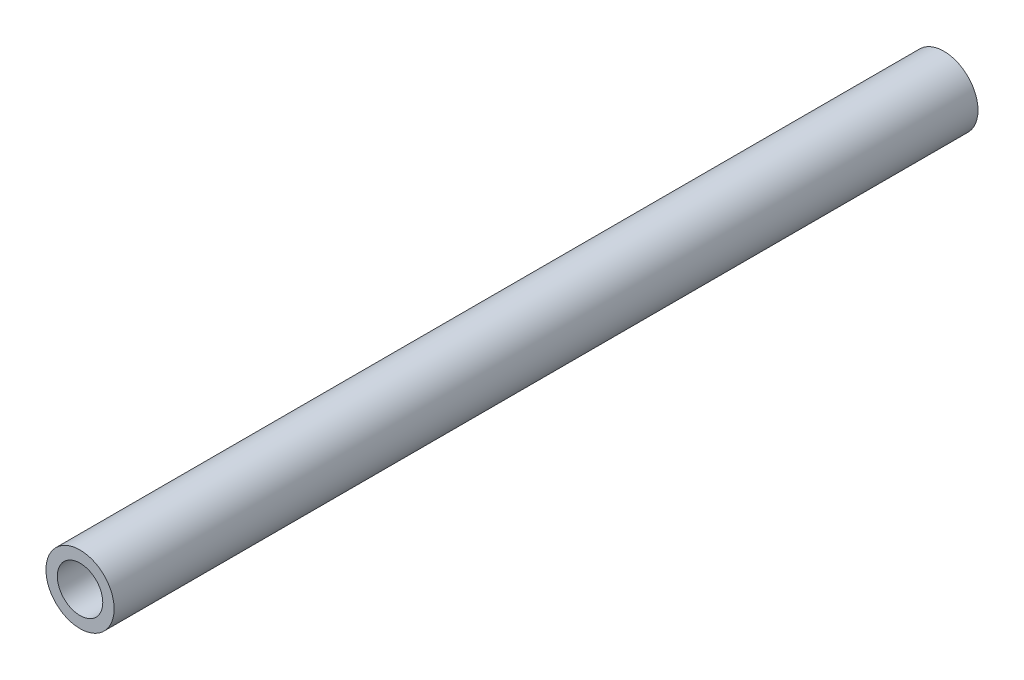
ISO-10303-21;
HEADER;
FILE_DESCRIPTION(('STEP AP214'),'2;1');
FILE_NAME('part.step','',(''),(''),'','','');
FILE_SCHEMA(('AUTOMOTIVE_DESIGN { 1 0 10303 214 1 1 1 1 }'));
ENDSEC;
DATA;
#1=APPLICATION_CONTEXT('core data for automotive mechanical design processes');
#2=APPLICATION_PROTOCOL_DEFINITION('international standard','automotive_design',2000,#1);
#3=PRODUCT_CONTEXT('',#1,'mechanical');
#4=PRODUCT('Part','Part','',(#3));
#5=PRODUCT_RELATED_PRODUCT_CATEGORY('part','',(#4));
#6=PRODUCT_DEFINITION_FORMATION('','',#4);
#7=PRODUCT_DEFINITION_CONTEXT('part definition',#1,'design');
#8=PRODUCT_DEFINITION('design','',#6,#7);
#9=PRODUCT_DEFINITION_SHAPE('','',#8);
#10=(LENGTH_UNIT() NAMED_UNIT(*) SI_UNIT(.MILLI.,.METRE.));
#11=(NAMED_UNIT(*) PLANE_ANGLE_UNIT() SI_UNIT($,.RADIAN.));
#12=(NAMED_UNIT(*) SI_UNIT($,.STERADIAN.) SOLID_ANGLE_UNIT());
#13=UNCERTAINTY_MEASURE_WITH_UNIT(LENGTH_MEASURE(1.E-05),#10,'distance_accuracy_value','');
#14=(GEOMETRIC_REPRESENTATION_CONTEXT(3) GLOBAL_UNCERTAINTY_ASSIGNED_CONTEXT((#13)) GLOBAL_UNIT_ASSIGNED_CONTEXT((#10,
#11,#12)) REPRESENTATION_CONTEXT('',''));
#15=CARTESIAN_POINT('',(0.,0.,0.));
#16=DIRECTION('',(0.,0.,1.));
#17=DIRECTION('',(1.,0.,0.));
#18=AXIS2_PLACEMENT_3D('',#15,#16,#17);
#19=CARTESIAN_POINT('',(0.,0.,38.));
#20=DIRECTION('',(0.,0.,1.));
#21=DIRECTION('',(1.,0.,0.));
#22=AXIS2_PLACEMENT_3D('',#19,#20,#21);
#23=PLANE('',#22);
#24=CARTESIAN_POINT('',(0.,0.,38.));
#25=DIRECTION('',(0.,0.,1.));
#26=DIRECTION('',(1.,0.,0.));
#27=AXIS2_PLACEMENT_3D('',#24,#25,#26);
#28=CIRCLE('',#27,1.5);
#29=CARTESIAN_POINT('',(1.5,0.,38.));
#30=VERTEX_POINT('',#29);
#31=EDGE_CURVE('E10',#30,#30,#28,.T.);
#32=ORIENTED_EDGE('',*,*,#31,.T.);
#33=EDGE_LOOP('',(#32));
#34=FACE_BOUND('',#33,.T.);
#35=CARTESIAN_POINT('',(0.,0.,38.));
#36=DIRECTION('',(0.,0.,1.));
#37=DIRECTION('',(1.,0.,0.));
#38=AXIS2_PLACEMENT_3D('',#35,#36,#37);
#39=CIRCLE('',#38,1.);
#40=CARTESIAN_POINT('',(1.,0.,38.));
#41=VERTEX_POINT('',#40);
#42=EDGE_CURVE('E43',#41,#41,#39,.T.);
#43=ORIENTED_EDGE('',*,*,#42,.F.);
#44=EDGE_LOOP('',(#43));
#45=FACE_BOUND('',#44,.T.);
#46=ADVANCED_FACE('F32',(#34,#45),#23,.T.);
#47=CARTESIAN_POINT('',(0.,0.,0.));
#48=DIRECTION('',(0.,0.,1.));
#49=DIRECTION('',(1.,0.,0.));
#50=AXIS2_PLACEMENT_3D('',#47,#48,#49);
#51=PLANE('',#50);
#52=CARTESIAN_POINT('',(0.,0.,0.));
#53=DIRECTION('',(0.,0.,1.));
#54=DIRECTION('',(1.,0.,0.));
#55=AXIS2_PLACEMENT_3D('',#52,#53,#54);
#56=CIRCLE('',#55,1.5);
#57=CARTESIAN_POINT('',(1.5,0.,0.));
#58=VERTEX_POINT('',#57);
#59=EDGE_CURVE('E36',#58,#58,#56,.T.);
#60=ORIENTED_EDGE('',*,*,#59,.F.);
#61=EDGE_LOOP('',(#60));
#62=FACE_BOUND('',#61,.T.);
#63=CARTESIAN_POINT('',(0.,0.,0.));
#64=DIRECTION('',(0.,0.,1.));
#65=DIRECTION('',(1.,0.,0.));
#66=AXIS2_PLACEMENT_3D('',#63,#64,#65);
#67=CIRCLE('',#66,1.);
#68=CARTESIAN_POINT('',(1.,0.,0.));
#69=VERTEX_POINT('',#68);
#70=EDGE_CURVE('E45',#69,#69,#67,.T.);
#71=ORIENTED_EDGE('',*,*,#70,.T.);
#72=EDGE_LOOP('',(#71));
#73=FACE_BOUND('',#72,.T.);
#74=ADVANCED_FACE('F55',(#62,#73),#51,.F.);
#75=CARTESIAN_POINT('',(0.,0.,38.));
#76=DIRECTION('',(0.,0.,-1.));
#77=DIRECTION('',(-1.,0.,0.));
#78=AXIS2_PLACEMENT_3D('',#75,#76,#77);
#79=CYLINDRICAL_SURFACE('',#78,1.5);
#80=ORIENTED_EDGE('',*,*,#31,.F.);
#81=EDGE_LOOP('',(#80));
#82=FACE_BOUND('',#81,.T.);
#83=ORIENTED_EDGE('',*,*,#59,.T.);
#84=EDGE_LOOP('',(#83));
#85=FACE_BOUND('',#84,.T.);
#86=ADVANCED_FACE('F34',(#82,#85),#79,.T.);
#87=CARTESIAN_POINT('',(0.,0.,38.));
#88=DIRECTION('',(0.,0.,-1.));
#89=DIRECTION('',(-1.,0.,0.));
#90=AXIS2_PLACEMENT_3D('',#87,#88,#89);
#91=CYLINDRICAL_SURFACE('',#90,1.);
#92=ORIENTED_EDGE('',*,*,#42,.T.);
#93=EDGE_LOOP('',(#92));
#94=FACE_BOUND('',#93,.T.);
#95=ORIENTED_EDGE('',*,*,#70,.F.);
#96=EDGE_LOOP('',(#95));
#97=FACE_BOUND('',#96,.T.);
#98=ADVANCED_FACE('F51',(#94,#97),#91,.F.);
#99=CLOSED_SHELL('',(#46,#74,#86,#98));
#100=MANIFOLD_SOLID_BREP('B2',#99);
#101=ADVANCED_BREP_SHAPE_REPRESENTATION('',(#18,#100),#14);
#102=SHAPE_DEFINITION_REPRESENTATION(#9,#101);
ENDSEC;
END-ISO-10303-21;
